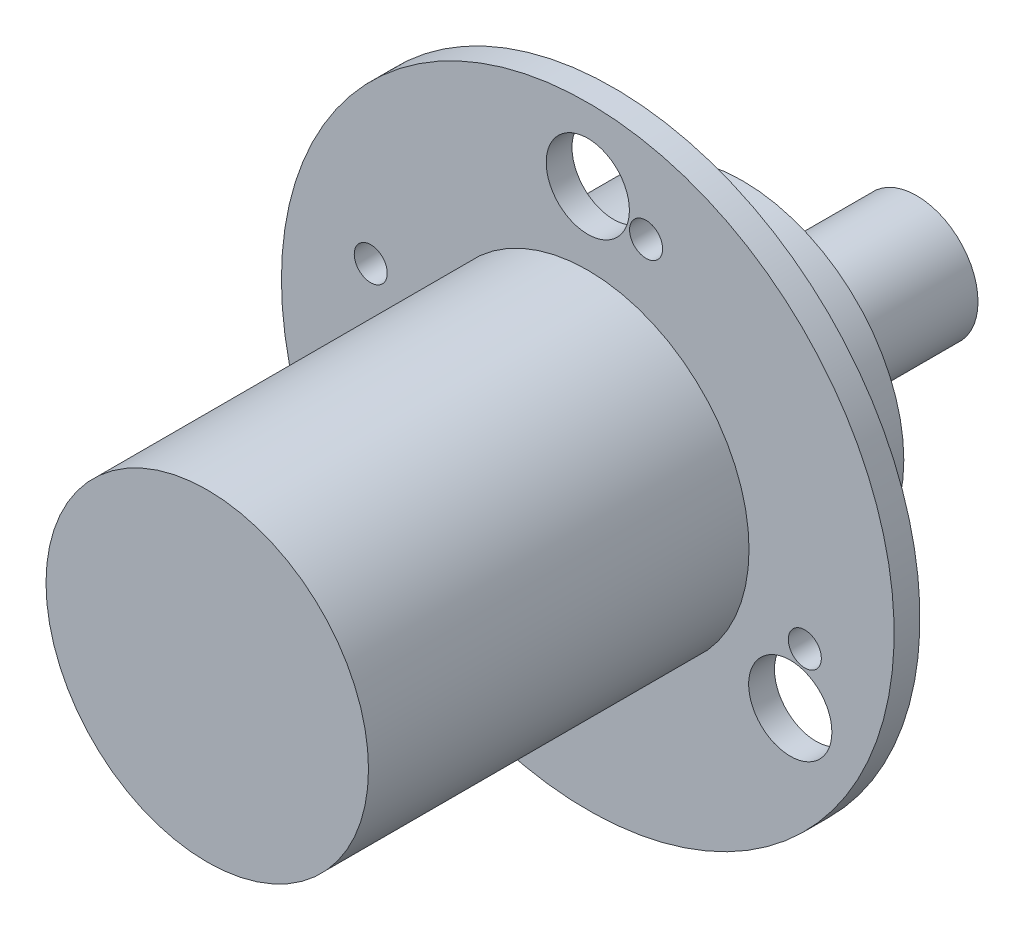
ISO-10303-21;
HEADER;
FILE_DESCRIPTION(('STEP AP214'),'2;1');
FILE_NAME('part.step','',(''),(''),'','','');
FILE_SCHEMA(('AUTOMOTIVE_DESIGN { 1 0 10303 214 1 1 1 1 }'));
ENDSEC;
DATA;
#1=APPLICATION_CONTEXT('core data for automotive mechanical design processes');
#2=APPLICATION_PROTOCOL_DEFINITION('international standard','automotive_design',2000,#1);
#3=PRODUCT_CONTEXT('',#1,'mechanical');
#4=PRODUCT('Part','Part','',(#3));
#5=PRODUCT_RELATED_PRODUCT_CATEGORY('part','',(#4));
#6=PRODUCT_DEFINITION_FORMATION('','',#4);
#7=PRODUCT_DEFINITION_CONTEXT('part definition',#1,'design');
#8=PRODUCT_DEFINITION('design','',#6,#7);
#9=PRODUCT_DEFINITION_SHAPE('','',#8);
#10=(LENGTH_UNIT() NAMED_UNIT(*) SI_UNIT(.MILLI.,.METRE.));
#11=(NAMED_UNIT(*) PLANE_ANGLE_UNIT() SI_UNIT($,.RADIAN.));
#12=(NAMED_UNIT(*) SI_UNIT($,.STERADIAN.) SOLID_ANGLE_UNIT());
#13=UNCERTAINTY_MEASURE_WITH_UNIT(LENGTH_MEASURE(1.E-05),#10,'distance_accuracy_value','');
#14=(GEOMETRIC_REPRESENTATION_CONTEXT(3) GLOBAL_UNCERTAINTY_ASSIGNED_CONTEXT((#13)) GLOBAL_UNIT_ASSIGNED_CONTEXT((#10,
#11,#12)) REPRESENTATION_CONTEXT('',''));
#15=CARTESIAN_POINT('',(0.,0.,0.));
#16=DIRECTION('',(0.,0.,1.));
#17=DIRECTION('',(1.,0.,0.));
#18=AXIS2_PLACEMENT_3D('',#15,#16,#17);
#19=CARTESIAN_POINT('',(0.,0.,0.));
#20=DIRECTION('',(0.,0.,1.));
#21=DIRECTION('',(1.,0.,0.));
#22=AXIS2_PLACEMENT_3D('',#19,#20,#21);
#23=PLANE('',#22);
#24=CARTESIAN_POINT('',(0.,0.,0.));
#25=DIRECTION('',(0.,0.,1.));
#26=DIRECTION('',(1.,0.,0.));
#27=AXIS2_PLACEMENT_3D('',#24,#25,#26);
#28=CIRCLE('',#27,6.35);
#29=CARTESIAN_POINT('',(6.35,0.,0.));
#30=VERTEX_POINT('',#29);
#31=EDGE_CURVE('E74',#30,#30,#28,.T.);
#32=ORIENTED_EDGE('',*,*,#31,.F.);
#33=EDGE_LOOP('',(#32));
#34=FACE_BOUND('',#33,.T.);
#35=CARTESIAN_POINT('',(0.,0.,0.));
#36=DIRECTION('',(0.,0.,1.));
#37=DIRECTION('',(1.,0.,0.));
#38=AXIS2_PLACEMENT_3D('',#35,#36,#37);
#39=CIRCLE('',#38,2.413);
#40=CARTESIAN_POINT('',(2.413,0.,0.));
#41=VERTEX_POINT('',#40);
#42=EDGE_CURVE('E36',#41,#41,#39,.F.);
#43=ORIENTED_EDGE('',*,*,#42,.F.);
#44=EDGE_LOOP('',(#43));
#45=FACE_BOUND('',#44,.T.);
#46=ADVANCED_FACE('F28',(#34,#45),#23,.F.);
#47=CARTESIAN_POINT('',(0.,0.,21.082));
#48=DIRECTION('',(0.,0.,-1.));
#49=DIRECTION('',(-1.,0.,0.));
#50=AXIS2_PLACEMENT_3D('',#47,#48,#49);
#51=CYLINDRICAL_SURFACE('',#50,6.35);
#52=CARTESIAN_POINT('',(0.,0.,5.08));
#53=DIRECTION('',(0.,0.,-1.));
#54=DIRECTION('',(-1.,0.,0.));
#55=AXIS2_PLACEMENT_3D('',#52,#53,#54);
#56=CIRCLE('',#55,6.35);
#57=CARTESIAN_POINT('',(-6.35,0.,5.08));
#58=VERTEX_POINT('',#57);
#59=EDGE_CURVE('E45',#58,#58,#56,.T.);
#60=ORIENTED_EDGE('',*,*,#59,.T.);
#61=EDGE_LOOP('',(#60));
#62=FACE_BOUND('',#61,.T.);
#63=ORIENTED_EDGE('',*,*,#31,.T.);
#64=EDGE_LOOP('',(#63));
#65=FACE_BOUND('',#64,.T.);
#66=ADVANCED_FACE('F30',(#62,#65),#51,.T.);
#67=CARTESIAN_POINT('',(0.,0.,-6.858));
#68=DIRECTION('',(0.,0.,1.));
#69=DIRECTION('',(1.,0.,0.));
#70=AXIS2_PLACEMENT_3D('',#67,#68,#69);
#71=CYLINDRICAL_SURFACE('',#70,2.413);
#72=CARTESIAN_POINT('',(0.,0.,-6.858));
#73=DIRECTION('',(0.,0.,-1.));
#74=DIRECTION('',(-1.,0.,0.));
#75=AXIS2_PLACEMENT_3D('',#72,#73,#74);
#76=CIRCLE('',#75,2.413);
#77=CARTESIAN_POINT('',(-2.413,0.,-6.858));
#78=VERTEX_POINT('',#77);
#79=EDGE_CURVE('E71',#78,#78,#76,.T.);
#80=ORIENTED_EDGE('',*,*,#79,.F.);
#81=EDGE_LOOP('',(#80));
#82=FACE_BOUND('',#81,.T.);
#83=ORIENTED_EDGE('',*,*,#42,.T.);
#84=EDGE_LOOP('',(#83));
#85=FACE_BOUND('',#84,.T.);
#86=ADVANCED_FACE('F95',(#82,#85),#71,.T.);
#87=CARTESIAN_POINT('',(0.,0.,-6.858));
#88=DIRECTION('',(0.,0.,-1.));
#89=DIRECTION('',(-1.,0.,0.));
#90=AXIS2_PLACEMENT_3D('',#87,#88,#89);
#91=PLANE('',#90);
#92=ORIENTED_EDGE('',*,*,#79,.T.);
#93=EDGE_LOOP('',(#92));
#94=FACE_BOUND('',#93,.T.);
#95=ADVANCED_FACE('F107',(#94),#91,.T.);
#96=CARTESIAN_POINT('',(0.,0.,6.096));
#97=DIRECTION('',(0.,0.,-1.));
#98=DIRECTION('',(-1.,0.,0.));
#99=AXIS2_PLACEMENT_3D('',#96,#97,#98);
#100=PLANE('',#99);
#101=CARTESIAN_POINT('',(-8.54708745885252,2.29560361794583,6.096));
#102=DIRECTION('',(0.,0.,-1.));
#103=DIRECTION('',(-1.,0.,0.));
#104=AXIS2_PLACEMENT_3D('',#101,#102,#103);
#105=CIRCLE('',#104,0.649999999999999);
#106=CARTESIAN_POINT('',(-9.19708745885252,2.29560361794583,6.096));
#107=VERTEX_POINT('',#106);
#108=EDGE_CURVE('E148',#107,#107,#105,.T.);
#109=ORIENTED_EDGE('',*,*,#108,.T.);
#110=EDGE_LOOP('',(#109));
#111=FACE_BOUND('',#110,.T.);
#112=CARTESIAN_POINT('',(2.29560361794586,8.54708745885251,6.096));
#113=DIRECTION('',(0.,0.,-1.));
#114=DIRECTION('',(-1.,0.,0.));
#115=AXIS2_PLACEMENT_3D('',#112,#113,#114);
#116=CIRCLE('',#115,0.65);
#117=CARTESIAN_POINT('',(1.64560361794586,8.54708745885251,6.096));
#118=VERTEX_POINT('',#117);
#119=EDGE_CURVE('E152',#118,#118,#116,.T.);
#120=ORIENTED_EDGE('',*,*,#119,.T.);
#121=EDGE_LOOP('',(#120));
#122=FACE_BOUND('',#121,.T.);
#123=CARTESIAN_POINT('',(8.5470874588525,-2.29560361794589,6.096));
#124=DIRECTION('',(0.,0.,-1.));
#125=DIRECTION('',(-1.,0.,0.));
#126=AXIS2_PLACEMENT_3D('',#123,#124,#125);
#127=CIRCLE('',#126,0.649999999999999);
#128=CARTESIAN_POINT('',(7.89708745885251,-2.29560361794589,6.096));
#129=VERTEX_POINT('',#128);
#130=EDGE_CURVE('E160',#129,#129,#127,.T.);
#131=ORIENTED_EDGE('',*,*,#130,.T.);
#132=EDGE_LOOP('',(#131));
#133=FACE_BOUND('',#132,.T.);
#134=CARTESIAN_POINT('',(-7.97392890534526,-4.60375,6.096));
#135=DIRECTION('',(0.,0.,1.));
#136=DIRECTION('',(1.,0.,0.));
#137=AXIS2_PLACEMENT_3D('',#134,#135,#136);
#138=CIRCLE('',#137,1.63830000000005);
#139=CARTESIAN_POINT('',(-6.33562890534521,-4.60375,6.096));
#140=VERTEX_POINT('',#139);
#141=EDGE_CURVE('E62',#140,#140,#138,.T.);
#142=ORIENTED_EDGE('',*,*,#141,.F.);
#143=EDGE_LOOP('',(#142));
#144=FACE_BOUND('',#143,.T.);
#145=CARTESIAN_POINT('',(7.9739289053452,-4.60375000000004,6.096));
#146=DIRECTION('',(0.,0.,1.));
#147=DIRECTION('',(1.,0.,0.));
#148=AXIS2_PLACEMENT_3D('',#145,#146,#147);
#149=CIRCLE('',#148,1.6383);
#150=CARTESIAN_POINT('',(9.6122289053452,-4.60375000000004,6.096));
#151=VERTEX_POINT('',#150);
#152=EDGE_CURVE('E52',#151,#151,#149,.T.);
#153=ORIENTED_EDGE('',*,*,#152,.F.);
#154=EDGE_LOOP('',(#153));
#155=FACE_BOUND('',#154,.T.);
#156=CARTESIAN_POINT('',(0.,9.2075,6.096));
#157=DIRECTION('',(0.,0.,1.));
#158=DIRECTION('',(1.,0.,0.));
#159=AXIS2_PLACEMENT_3D('',#156,#157,#158);
#160=CIRCLE('',#159,1.6383);
#161=CARTESIAN_POINT('',(1.6383,9.2075,6.096));
#162=VERTEX_POINT('',#161);
#163=EDGE_CURVE('E49',#162,#162,#160,.T.);
#164=ORIENTED_EDGE('',*,*,#163,.F.);
#165=EDGE_LOOP('',(#164));
#166=FACE_BOUND('',#165,.T.);
#167=CARTESIAN_POINT('',(0.,0.,6.096));
#168=DIRECTION('',(0.,0.,-1.));
#169=DIRECTION('',(-1.,0.,0.));
#170=AXIS2_PLACEMENT_3D('',#167,#168,#169);
#171=CIRCLE('',#170,12.065);
#172=CARTESIAN_POINT('',(-12.065,0.,6.096));
#173=VERTEX_POINT('',#172);
#174=EDGE_CURVE('E68',#173,#173,#171,.T.);
#175=ORIENTED_EDGE('',*,*,#174,.F.);
#176=EDGE_LOOP('',(#175));
#177=FACE_BOUND('',#176,.T.);
#178=CARTESIAN_POINT('',(0.,0.,6.096));
#179=DIRECTION('',(0.,0.,-1.));
#180=DIRECTION('',(-1.,0.,0.));
#181=AXIS2_PLACEMENT_3D('',#178,#179,#180);
#182=CIRCLE('',#181,6.35);
#183=CARTESIAN_POINT('',(-6.35,0.,6.096));
#184=VERTEX_POINT('',#183);
#185=EDGE_CURVE('E10',#184,#184,#182,.T.);
#186=ORIENTED_EDGE('',*,*,#185,.T.);
#187=EDGE_LOOP('',(#186));
#188=FACE_BOUND('',#187,.T.);
#189=ADVANCED_FACE('F111',(#111,#122,#133,#144,#155,#166,#177,#188),#100,.F.);
#190=CARTESIAN_POINT('',(0.,0.,5.08));
#191=DIRECTION('',(0.,0.,-1.));
#192=DIRECTION('',(-1.,0.,0.));
#193=AXIS2_PLACEMENT_3D('',#190,#191,#192);
#194=PLANE('',#193);
#195=CARTESIAN_POINT('',(-8.54708745885252,2.29560361794583,5.08));
#196=DIRECTION('',(0.,0.,-1.));
#197=DIRECTION('',(-1.,0.,0.));
#198=AXIS2_PLACEMENT_3D('',#195,#196,#197);
#199=CIRCLE('',#198,0.649999999999999);
#200=CARTESIAN_POINT('',(-9.19708745885252,2.29560361794583,5.08));
#201=VERTEX_POINT('',#200);
#202=EDGE_CURVE('E145',#201,#201,#199,.T.);
#203=ORIENTED_EDGE('',*,*,#202,.F.);
#204=EDGE_LOOP('',(#203));
#205=FACE_BOUND('',#204,.T.);
#206=CARTESIAN_POINT('',(2.29560361794586,8.54708745885251,5.08));
#207=DIRECTION('',(0.,0.,-1.));
#208=DIRECTION('',(-1.,0.,0.));
#209=AXIS2_PLACEMENT_3D('',#206,#207,#208);
#210=CIRCLE('',#209,0.65);
#211=CARTESIAN_POINT('',(1.64560361794586,8.54708745885251,5.08));
#212=VERTEX_POINT('',#211);
#213=EDGE_CURVE('E149',#212,#212,#210,.T.);
#214=ORIENTED_EDGE('',*,*,#213,.F.);
#215=EDGE_LOOP('',(#214));
#216=FACE_BOUND('',#215,.T.);
#217=CARTESIAN_POINT('',(8.5470874588525,-2.29560361794589,5.08));
#218=DIRECTION('',(0.,0.,-1.));
#219=DIRECTION('',(-1.,0.,0.));
#220=AXIS2_PLACEMENT_3D('',#217,#218,#219);
#221=CIRCLE('',#220,0.649999999999999);
#222=CARTESIAN_POINT('',(7.89708745885251,-2.29560361794589,5.08));
#223=VERTEX_POINT('',#222);
#224=EDGE_CURVE('E158',#223,#223,#221,.T.);
#225=ORIENTED_EDGE('',*,*,#224,.F.);
#226=EDGE_LOOP('',(#225));
#227=FACE_BOUND('',#226,.T.);
#228=CARTESIAN_POINT('',(-7.97392890534526,-4.60375,5.08));
#229=DIRECTION('',(0.,0.,-1.));
#230=DIRECTION('',(-1.,0.,0.));
#231=AXIS2_PLACEMENT_3D('',#228,#229,#230);
#232=CIRCLE('',#231,1.63830000000005);
#233=CARTESIAN_POINT('',(-9.61222890534531,-4.60375,5.08));
#234=VERTEX_POINT('',#233);
#235=EDGE_CURVE('E32',#234,#234,#232,.T.);
#236=ORIENTED_EDGE('',*,*,#235,.F.);
#237=EDGE_LOOP('',(#236));
#238=FACE_BOUND('',#237,.T.);
#239=CARTESIAN_POINT('',(7.9739289053452,-4.60375000000004,5.08));
#240=DIRECTION('',(0.,0.,-1.));
#241=DIRECTION('',(-1.,0.,0.));
#242=AXIS2_PLACEMENT_3D('',#239,#240,#241);
#243=CIRCLE('',#242,1.6383);
#244=CARTESIAN_POINT('',(6.3356289053452,-4.60375000000004,5.08));
#245=VERTEX_POINT('',#244);
#246=EDGE_CURVE('E50',#245,#245,#243,.T.);
#247=ORIENTED_EDGE('',*,*,#246,.F.);
#248=EDGE_LOOP('',(#247));
#249=FACE_BOUND('',#248,.T.);
#250=CARTESIAN_POINT('',(0.,9.2075,5.08));
#251=DIRECTION('',(0.,0.,-1.));
#252=DIRECTION('',(-1.,0.,0.));
#253=AXIS2_PLACEMENT_3D('',#250,#251,#252);
#254=CIRCLE('',#253,1.6383);
#255=CARTESIAN_POINT('',(-1.6383,9.2075,5.08));
#256=VERTEX_POINT('',#255);
#257=EDGE_CURVE('E46',#256,#256,#254,.T.);
#258=ORIENTED_EDGE('',*,*,#257,.F.);
#259=EDGE_LOOP('',(#258));
#260=FACE_BOUND('',#259,.T.);
#261=CARTESIAN_POINT('',(0.,0.,5.08));
#262=DIRECTION('',(0.,0.,-1.));
#263=DIRECTION('',(-1.,0.,0.));
#264=AXIS2_PLACEMENT_3D('',#261,#262,#263);
#265=CIRCLE('',#264,12.065);
#266=CARTESIAN_POINT('',(-12.065,0.,5.08));
#267=VERTEX_POINT('',#266);
#268=EDGE_CURVE('E48',#267,#267,#265,.T.);
#269=ORIENTED_EDGE('',*,*,#268,.T.);
#270=EDGE_LOOP('',(#269));
#271=FACE_BOUND('',#270,.T.);
#272=ORIENTED_EDGE('',*,*,#59,.F.);
#273=EDGE_LOOP('',(#272));
#274=FACE_BOUND('',#273,.T.);
#275=ADVANCED_FACE('F115',(#205,#216,#227,#238,#249,#260,#271,#274),#194,.T.);
#276=CARTESIAN_POINT('',(0.,0.,6.096));
#277=DIRECTION('',(0.,0.,-1.));
#278=DIRECTION('',(-1.,0.,0.));
#279=AXIS2_PLACEMENT_3D('',#276,#277,#278);
#280=CYLINDRICAL_SURFACE('',#279,12.065);
#281=ORIENTED_EDGE('',*,*,#174,.T.);
#282=EDGE_LOOP('',(#281));
#283=FACE_BOUND('',#282,.T.);
#284=ORIENTED_EDGE('',*,*,#268,.F.);
#285=EDGE_LOOP('',(#284));
#286=FACE_BOUND('',#285,.T.);
#287=ADVANCED_FACE('F93',(#283,#286),#280,.T.);
#288=CARTESIAN_POINT('',(0.,0.,21.082));
#289=DIRECTION('',(0.,0.,1.));
#290=DIRECTION('',(1.,0.,0.));
#291=AXIS2_PLACEMENT_3D('',#288,#289,#290);
#292=PLANE('',#291);
#293=CARTESIAN_POINT('',(0.,0.,21.082));
#294=DIRECTION('',(0.,0.,1.));
#295=DIRECTION('',(1.,0.,0.));
#296=AXIS2_PLACEMENT_3D('',#293,#294,#295);
#297=CIRCLE('',#296,6.35);
#298=CARTESIAN_POINT('',(6.35,0.,21.082));
#299=VERTEX_POINT('',#298);
#300=EDGE_CURVE('E41',#299,#299,#297,.T.);
#301=ORIENTED_EDGE('',*,*,#300,.T.);
#302=EDGE_LOOP('',(#301));
#303=FACE_BOUND('',#302,.T.);
#304=ADVANCED_FACE('F80',(#303),#292,.T.);
#305=ORIENTED_EDGE('',*,*,#300,.F.);
#306=EDGE_LOOP('',(#305));
#307=FACE_BOUND('',#306,.T.);
#308=ORIENTED_EDGE('',*,*,#185,.F.);
#309=EDGE_LOOP('',(#308));
#310=FACE_BOUND('',#309,.T.);
#311=ADVANCED_FACE('F82',(#307,#310),#51,.T.);
#312=CARTESIAN_POINT('',(0.,9.2075,-6.858));
#313=DIRECTION('',(0.,0.,1.));
#314=DIRECTION('',(1.,0.,0.));
#315=AXIS2_PLACEMENT_3D('',#312,#313,#314);
#316=CYLINDRICAL_SURFACE('',#315,1.6383);
#317=ORIENTED_EDGE('',*,*,#257,.T.);
#318=EDGE_LOOP('',(#317));
#319=FACE_BOUND('',#318,.T.);
#320=ORIENTED_EDGE('',*,*,#163,.T.);
#321=EDGE_LOOP('',(#320));
#322=FACE_BOUND('',#321,.T.);
#323=ADVANCED_FACE('F85',(#319,#322),#316,.F.);
#324=CARTESIAN_POINT('',(7.9739289053452,-4.60375000000004,-6.858));
#325=DIRECTION('',(0.,0.,1.));
#326=DIRECTION('',(1.,0.,0.));
#327=AXIS2_PLACEMENT_3D('',#324,#325,#326);
#328=CYLINDRICAL_SURFACE('',#327,1.6383);
#329=ORIENTED_EDGE('',*,*,#246,.T.);
#330=EDGE_LOOP('',(#329));
#331=FACE_BOUND('',#330,.T.);
#332=ORIENTED_EDGE('',*,*,#152,.T.);
#333=EDGE_LOOP('',(#332));
#334=FACE_BOUND('',#333,.T.);
#335=ADVANCED_FACE('F90',(#331,#334),#328,.F.);
#336=CARTESIAN_POINT('',(-7.97392890534526,-4.60375,-6.858));
#337=DIRECTION('',(0.,0.,1.));
#338=DIRECTION('',(1.,0.,0.));
#339=AXIS2_PLACEMENT_3D('',#336,#337,#338);
#340=CYLINDRICAL_SURFACE('',#339,1.63830000000005);
#341=ORIENTED_EDGE('',*,*,#235,.T.);
#342=EDGE_LOOP('',(#341));
#343=FACE_BOUND('',#342,.T.);
#344=ORIENTED_EDGE('',*,*,#141,.T.);
#345=EDGE_LOOP('',(#344));
#346=FACE_BOUND('',#345,.T.);
#347=ADVANCED_FACE('F125',(#343,#346),#340,.F.);
#348=CARTESIAN_POINT('',(8.5470874588525,-2.29560361794589,21.082));
#349=DIRECTION('',(0.,0.,-1.));
#350=DIRECTION('',(-1.,0.,0.));
#351=AXIS2_PLACEMENT_3D('',#348,#349,#350);
#352=CYLINDRICAL_SURFACE('',#351,0.649999999999999);
#353=ORIENTED_EDGE('',*,*,#224,.T.);
#354=EDGE_LOOP('',(#353));
#355=FACE_BOUND('',#354,.T.);
#356=ORIENTED_EDGE('',*,*,#130,.F.);
#357=EDGE_LOOP('',(#356));
#358=FACE_BOUND('',#357,.T.);
#359=ADVANCED_FACE('F128',(#355,#358),#352,.F.);
#360=CARTESIAN_POINT('',(2.29560361794586,8.54708745885251,21.082));
#361=DIRECTION('',(0.,0.,-1.));
#362=DIRECTION('',(-1.,0.,0.));
#363=AXIS2_PLACEMENT_3D('',#360,#361,#362);
#364=CYLINDRICAL_SURFACE('',#363,0.65);
#365=ORIENTED_EDGE('',*,*,#213,.T.);
#366=EDGE_LOOP('',(#365));
#367=FACE_BOUND('',#366,.T.);
#368=ORIENTED_EDGE('',*,*,#119,.F.);
#369=EDGE_LOOP('',(#368));
#370=FACE_BOUND('',#369,.T.);
#371=ADVANCED_FACE('F132',(#367,#370),#364,.F.);
#372=CARTESIAN_POINT('',(-8.54708745885252,2.29560361794583,21.082));
#373=DIRECTION('',(0.,0.,-1.));
#374=DIRECTION('',(-1.,0.,0.));
#375=AXIS2_PLACEMENT_3D('',#372,#373,#374);
#376=CYLINDRICAL_SURFACE('',#375,0.649999999999999);
#377=ORIENTED_EDGE('',*,*,#202,.T.);
#378=EDGE_LOOP('',(#377));
#379=FACE_BOUND('',#378,.T.);
#380=ORIENTED_EDGE('',*,*,#108,.F.);
#381=EDGE_LOOP('',(#380));
#382=FACE_BOUND('',#381,.T.);
#383=ADVANCED_FACE('F136',(#379,#382),#376,.F.);
#384=CLOSED_SHELL('',(#46,#66,#86,#95,#189,#275,#287,#304,#311,#323,#335,#347,#359,#371,#383));
#385=MANIFOLD_SOLID_BREP('B2',#384);
#386=ADVANCED_BREP_SHAPE_REPRESENTATION('',(#18,#385),#14);
#387=SHAPE_DEFINITION_REPRESENTATION(#9,#386);
ENDSEC;
END-ISO-10303-21;
